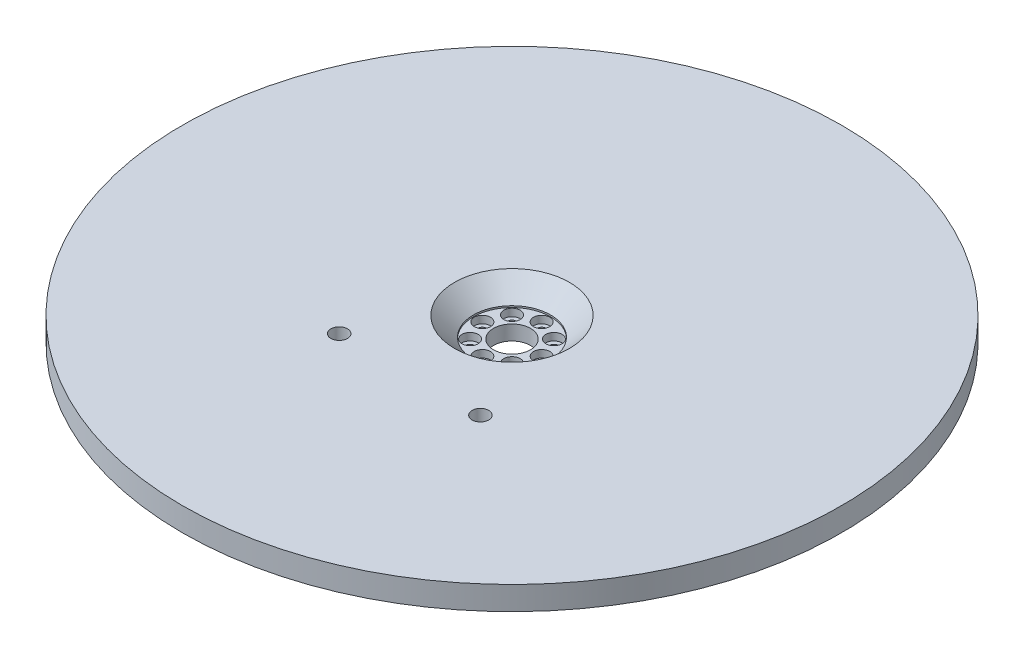
ISO-10303-21;
HEADER;
FILE_DESCRIPTION(('STEP AP214'),'2;1');
FILE_NAME('part.step','',(''),(''),'','','');
FILE_SCHEMA(('AUTOMOTIVE_DESIGN { 1 0 10303 214 1 1 1 1 }'));
ENDSEC;
DATA;
#1=APPLICATION_CONTEXT('core data for automotive mechanical design processes');
#2=APPLICATION_PROTOCOL_DEFINITION('international standard','automotive_design',2000,#1);
#3=PRODUCT_CONTEXT('',#1,'mechanical');
#4=PRODUCT('Part','Part','',(#3));
#5=PRODUCT_RELATED_PRODUCT_CATEGORY('part','',(#4));
#6=PRODUCT_DEFINITION_FORMATION('','',#4);
#7=PRODUCT_DEFINITION_CONTEXT('part definition',#1,'design');
#8=PRODUCT_DEFINITION('design','',#6,#7);
#9=PRODUCT_DEFINITION_SHAPE('','',#8);
#10=(LENGTH_UNIT() NAMED_UNIT(*) SI_UNIT(.MILLI.,.METRE.));
#11=(NAMED_UNIT(*) PLANE_ANGLE_UNIT() SI_UNIT($,.RADIAN.));
#12=(NAMED_UNIT(*) SI_UNIT($,.STERADIAN.) SOLID_ANGLE_UNIT());
#13=UNCERTAINTY_MEASURE_WITH_UNIT(LENGTH_MEASURE(1.E-05),#10,'distance_accuracy_value','');
#14=(GEOMETRIC_REPRESENTATION_CONTEXT(3) GLOBAL_UNCERTAINTY_ASSIGNED_CONTEXT((#13)) GLOBAL_UNIT_ASSIGNED_CONTEXT((#10,
#11,#12)) REPRESENTATION_CONTEXT('',''));
#15=CARTESIAN_POINT('',(0.,0.,0.));
#16=DIRECTION('',(0.,0.,1.));
#17=DIRECTION('',(1.,0.,0.));
#18=AXIS2_PLACEMENT_3D('',#15,#16,#17);
#19=CARTESIAN_POINT('',(0.,-2.35,0.));
#20=DIRECTION('',(0.,-1.,0.));
#21=DIRECTION('',(0.,0.,-1.));
#22=AXIS2_PLACEMENT_3D('',#19,#20,#21);
#23=PLANE('',#22);
#24=CARTESIAN_POINT('',(-5.6568542495,-2.35,-5.6568542495));
#25=DIRECTION('',(0.,1.,0.));
#26=DIRECTION('',(0.,0.,1.));
#27=AXIS2_PLACEMENT_3D('',#24,#25,#26);
#28=CIRCLE('',#27,2.19999999999999);
#29=CARTESIAN_POINT('',(-5.6568542495,-2.35,-3.45685424950001));
#30=VERTEX_POINT('',#29);
#31=EDGE_CURVE('E67',#30,#30,#28,.T.);
#32=ORIENTED_EDGE('',*,*,#31,.F.);
#33=EDGE_LOOP('',(#32));
#34=FACE_BOUND('',#33,.T.);
#35=CARTESIAN_POINT('',(0.,-2.35,-8.));
#36=DIRECTION('',(0.,1.,0.));
#37=DIRECTION('',(0.,0.,1.));
#38=AXIS2_PLACEMENT_3D('',#35,#36,#37);
#39=CIRCLE('',#38,2.19999999999999);
#40=CARTESIAN_POINT('',(0.,-2.35,-5.80000000000001));
#41=VERTEX_POINT('',#40);
#42=EDGE_CURVE('E71',#41,#41,#39,.T.);
#43=ORIENTED_EDGE('',*,*,#42,.F.);
#44=EDGE_LOOP('',(#43));
#45=FACE_BOUND('',#44,.T.);
#46=CARTESIAN_POINT('',(5.6568542495,-2.35,-5.6568542495));
#47=DIRECTION('',(0.,1.,0.));
#48=DIRECTION('',(0.,0.,1.));
#49=AXIS2_PLACEMENT_3D('',#46,#47,#48);
#50=CIRCLE('',#49,2.19999999999999);
#51=CARTESIAN_POINT('',(5.6568542495,-2.35,-3.45685424950001));
#52=VERTEX_POINT('',#51);
#53=EDGE_CURVE('E76',#52,#52,#50,.T.);
#54=ORIENTED_EDGE('',*,*,#53,.F.);
#55=EDGE_LOOP('',(#54));
#56=FACE_BOUND('',#55,.T.);
#57=CARTESIAN_POINT('',(8.,-2.35,0.));
#58=DIRECTION('',(0.,1.,0.));
#59=DIRECTION('',(0.,0.,1.));
#60=AXIS2_PLACEMENT_3D('',#57,#58,#59);
#61=CIRCLE('',#60,2.19999999999999);
#62=CARTESIAN_POINT('',(8.,-2.35,2.19999999999999));
#63=VERTEX_POINT('',#62);
#64=EDGE_CURVE('E81',#63,#63,#61,.T.);
#65=ORIENTED_EDGE('',*,*,#64,.F.);
#66=EDGE_LOOP('',(#65));
#67=FACE_BOUND('',#66,.T.);
#68=CARTESIAN_POINT('',(5.6568542495,-2.35,5.6568542495));
#69=DIRECTION('',(0.,1.,0.));
#70=DIRECTION('',(0.,0.,1.));
#71=AXIS2_PLACEMENT_3D('',#68,#69,#70);
#72=CIRCLE('',#71,2.19999999999999);
#73=CARTESIAN_POINT('',(5.6568542495,-2.35,7.85685424949999));
#74=VERTEX_POINT('',#73);
#75=EDGE_CURVE('E86',#74,#74,#72,.T.);
#76=ORIENTED_EDGE('',*,*,#75,.F.);
#77=EDGE_LOOP('',(#76));
#78=FACE_BOUND('',#77,.T.);
#79=CARTESIAN_POINT('',(-5.6568542495,-2.35,5.6568542495));
#80=DIRECTION('',(0.,1.,0.));
#81=DIRECTION('',(0.,0.,1.));
#82=AXIS2_PLACEMENT_3D('',#79,#80,#81);
#83=CIRCLE('',#82,2.19999999999999);
#84=CARTESIAN_POINT('',(-5.6568542495,-2.35,7.85685424949999));
#85=VERTEX_POINT('',#84);
#86=EDGE_CURVE('E96',#85,#85,#83,.T.);
#87=ORIENTED_EDGE('',*,*,#86,.F.);
#88=EDGE_LOOP('',(#87));
#89=FACE_BOUND('',#88,.T.);
#90=CARTESIAN_POINT('',(-8.,-2.35,0.));
#91=DIRECTION('',(0.,1.,0.));
#92=DIRECTION('',(0.,0.,1.));
#93=AXIS2_PLACEMENT_3D('',#90,#91,#92);
#94=CIRCLE('',#93,2.19999999999999);
#95=CARTESIAN_POINT('',(-8.,-2.35,2.19999999999999));
#96=VERTEX_POINT('',#95);
#97=EDGE_CURVE('E101',#96,#96,#94,.T.);
#98=ORIENTED_EDGE('',*,*,#97,.F.);
#99=EDGE_LOOP('',(#98));
#100=FACE_BOUND('',#99,.T.);
#101=CARTESIAN_POINT('',(0.,-2.35,0.));
#102=DIRECTION('',(0.,1.,0.));
#103=DIRECTION('',(0.,0.,1.));
#104=AXIS2_PLACEMENT_3D('',#101,#102,#103);
#105=CIRCLE('',#104,5.);
#106=CARTESIAN_POINT('',(0.,-2.35,5.));
#107=VERTEX_POINT('',#106);
#108=EDGE_CURVE('E119',#107,#107,#105,.T.);
#109=ORIENTED_EDGE('',*,*,#108,.F.);
#110=EDGE_LOOP('',(#109));
#111=FACE_BOUND('',#110,.T.);
#112=CARTESIAN_POINT('',(0.,-2.35,0.));
#113=DIRECTION('',(0.,-1.,0.));
#114=DIRECTION('',(0.,0.,-1.));
#115=AXIS2_PLACEMENT_3D('',#112,#113,#114);
#116=CIRCLE('',#115,10.4);
#117=CARTESIAN_POINT('',(0.,-2.35,-10.4));
#118=VERTEX_POINT('',#117);
#119=EDGE_CURVE('E116',#118,#118,#116,.F.);
#120=ORIENTED_EDGE('',*,*,#119,.T.);
#121=EDGE_LOOP('',(#120));
#122=FACE_BOUND('',#121,.T.);
#123=CARTESIAN_POINT('',(0.,-2.35,8.));
#124=DIRECTION('',(0.,1.,0.));
#125=DIRECTION('',(0.,0.,1.));
#126=AXIS2_PLACEMENT_3D('',#123,#124,#125);
#127=CIRCLE('',#126,2.19999999999999);
#128=CARTESIAN_POINT('',(0.,-2.35,10.2));
#129=VERTEX_POINT('',#128);
#130=EDGE_CURVE('E91',#129,#129,#127,.T.);
#131=ORIENTED_EDGE('',*,*,#130,.F.);
#132=EDGE_LOOP('',(#131));
#133=FACE_BOUND('',#132,.T.);
#134=ADVANCED_FACE('F40',(#34,#45,#56,#67,#78,#89,#100,#111,#122,#133),#23,.F.);
#135=CARTESIAN_POINT('',(0.,3.175,0.));
#136=DIRECTION('',(0.,-1.,0.));
#137=DIRECTION('',(0.,0.,-1.));
#138=AXIS2_PLACEMENT_3D('',#135,#136,#137);
#139=CYLINDRICAL_SURFACE('',#138,88.9);
#140=CARTESIAN_POINT('',(0.,3.175,0.));
#141=DIRECTION('',(0.,1.,0.));
#142=DIRECTION('',(0.,0.,1.));
#143=AXIS2_PLACEMENT_3D('',#140,#141,#142);
#144=CIRCLE('',#143,88.9);
#145=CARTESIAN_POINT('',(0.,3.175,88.9));
#146=VERTEX_POINT('',#145);
#147=EDGE_CURVE('E56',#146,#146,#144,.T.);
#148=ORIENTED_EDGE('',*,*,#147,.F.);
#149=EDGE_LOOP('',(#148));
#150=FACE_BOUND('',#149,.T.);
#151=CARTESIAN_POINT('',(0.,-3.175,0.));
#152=DIRECTION('',(0.,1.,0.));
#153=DIRECTION('',(0.,0.,1.));
#154=AXIS2_PLACEMENT_3D('',#151,#152,#153);
#155=CIRCLE('',#154,88.9);
#156=CARTESIAN_POINT('',(0.,-3.175,88.9));
#157=VERTEX_POINT('',#156);
#158=EDGE_CURVE('E108',#157,#157,#155,.T.);
#159=ORIENTED_EDGE('',*,*,#158,.T.);
#160=EDGE_LOOP('',(#159));
#161=FACE_BOUND('',#160,.T.);
#162=ADVANCED_FACE('F192',(#150,#161),#139,.T.);
#163=CARTESIAN_POINT('',(0.,3.175,0.));
#164=DIRECTION('',(0.,1.,0.));
#165=DIRECTION('',(0.,0.,1.));
#166=AXIS2_PLACEMENT_3D('',#163,#164,#165);
#167=PLANE('',#166);
#168=CARTESIAN_POINT('',(0.,3.175,0.));
#169=DIRECTION('',(0.,1.,0.));
#170=DIRECTION('',(0.,0.,1.));
#171=AXIS2_PLACEMENT_3D('',#168,#169,#170);
#172=CIRCLE('',#171,15.48);
#173=CARTESIAN_POINT('',(0.,3.175,15.48));
#174=VERTEX_POINT('',#173);
#175=EDGE_CURVE('E11',#174,#174,#172,.F.);
#176=ORIENTED_EDGE('',*,*,#175,.T.);
#177=EDGE_LOOP('',(#176));
#178=FACE_BOUND('',#177,.T.);
#179=CARTESIAN_POINT('',(19.0499999999564,3.175,27.5642423430902));
#180=DIRECTION('',(0.,1.,0.));
#181=DIRECTION('',(0.,0.,1.));
#182=AXIS2_PLACEMENT_3D('',#179,#180,#181);
#183=CIRCLE('',#182,2.24999999999999);
#184=CARTESIAN_POINT('',(19.0499999999564,3.175,29.8142423430901));
#185=VERTEX_POINT('',#184);
#186=EDGE_CURVE('E63',#185,#185,#183,.T.);
#187=ORIENTED_EDGE('',*,*,#186,.F.);
#188=EDGE_LOOP('',(#187));
#189=FACE_BOUND('',#188,.T.);
#190=CARTESIAN_POINT('',(-19.0500000000436,3.175,27.5642423430902));
#191=DIRECTION('',(0.,1.,0.));
#192=DIRECTION('',(0.,0.,1.));
#193=AXIS2_PLACEMENT_3D('',#190,#191,#192);
#194=CIRCLE('',#193,2.24999999999999);
#195=CARTESIAN_POINT('',(-19.0500000000436,3.175,29.8142423430901));
#196=VERTEX_POINT('',#195);
#197=EDGE_CURVE('E62',#196,#196,#194,.T.);
#198=ORIENTED_EDGE('',*,*,#197,.F.);
#199=EDGE_LOOP('',(#198));
#200=FACE_BOUND('',#199,.T.);
#201=ORIENTED_EDGE('',*,*,#147,.T.);
#202=EDGE_LOOP('',(#201));
#203=FACE_BOUND('',#202,.T.);
#204=ADVANCED_FACE('F188',(#178,#189,#200,#203),#167,.T.);
#205=CARTESIAN_POINT('',(0.,-3.175,0.));
#206=DIRECTION('',(0.,1.,0.));
#207=DIRECTION('',(0.,0.,1.));
#208=AXIS2_PLACEMENT_3D('',#205,#206,#207);
#209=PLANE('',#208);
#210=CARTESIAN_POINT('',(19.0499999999564,-3.175,27.5642423430902));
#211=DIRECTION('',(0.,1.,0.));
#212=DIRECTION('',(0.,0.,1.));
#213=AXIS2_PLACEMENT_3D('',#210,#211,#212);
#214=CIRCLE('',#213,2.24999999999999);
#215=CARTESIAN_POINT('',(19.0499999999564,-3.175,29.8142423430901));
#216=VERTEX_POINT('',#215);
#217=EDGE_CURVE('E59',#216,#216,#214,.T.);
#218=ORIENTED_EDGE('',*,*,#217,.T.);
#219=EDGE_LOOP('',(#218));
#220=FACE_BOUND('',#219,.T.);
#221=CARTESIAN_POINT('',(-19.0500000000436,-3.175,27.5642423430902));
#222=DIRECTION('',(0.,1.,0.));
#223=DIRECTION('',(0.,0.,1.));
#224=AXIS2_PLACEMENT_3D('',#221,#222,#223);
#225=CIRCLE('',#224,2.24999999999999);
#226=CARTESIAN_POINT('',(-19.0500000000436,-3.175,29.8142423430901));
#227=VERTEX_POINT('',#226);
#228=EDGE_CURVE('E64',#227,#227,#225,.T.);
#229=ORIENTED_EDGE('',*,*,#228,.T.);
#230=EDGE_LOOP('',(#229));
#231=FACE_BOUND('',#230,.T.);
#232=CARTESIAN_POINT('',(0.,-3.175,0.));
#233=DIRECTION('',(0.,1.,0.));
#234=DIRECTION('',(0.,0.,1.));
#235=AXIS2_PLACEMENT_3D('',#232,#233,#234);
#236=CIRCLE('',#235,12.065);
#237=CARTESIAN_POINT('',(0.,-3.175,12.065));
#238=VERTEX_POINT('',#237);
#239=EDGE_CURVE('E52',#238,#238,#236,.F.);
#240=ORIENTED_EDGE('',*,*,#239,.F.);
#241=EDGE_LOOP('',(#240));
#242=FACE_BOUND('',#241,.T.);
#243=ORIENTED_EDGE('',*,*,#158,.F.);
#244=EDGE_LOOP('',(#243));
#245=FACE_BOUND('',#244,.T.);
#246=ADVANCED_FACE('F191',(#220,#231,#242,#245),#209,.F.);
#247=CARTESIAN_POINT('',(0.,-6.35,0.));
#248=DIRECTION('',(0.,1.,0.));
#249=DIRECTION('',(0.,0.,1.));
#250=AXIS2_PLACEMENT_3D('',#247,#248,#249);
#251=CYLINDRICAL_SURFACE('',#250,12.065);
#252=CARTESIAN_POINT('',(0.,-6.35,0.));
#253=DIRECTION('',(0.,-1.,0.));
#254=DIRECTION('',(0.,0.,-1.));
#255=AXIS2_PLACEMENT_3D('',#252,#253,#254);
#256=CIRCLE('',#255,12.065);
#257=CARTESIAN_POINT('',(0.,-6.35,-12.065));
#258=VERTEX_POINT('',#257);
#259=EDGE_CURVE('E111',#258,#258,#256,.T.);
#260=ORIENTED_EDGE('',*,*,#259,.F.);
#261=EDGE_LOOP('',(#260));
#262=FACE_BOUND('',#261,.T.);
#263=ORIENTED_EDGE('',*,*,#239,.T.);
#264=EDGE_LOOP('',(#263));
#265=FACE_BOUND('',#264,.T.);
#266=ADVANCED_FACE('F203',(#262,#265),#251,.T.);
#267=CARTESIAN_POINT('',(0.,-6.35,0.));
#268=DIRECTION('',(0.,-1.,0.));
#269=DIRECTION('',(0.,0.,-1.));
#270=AXIS2_PLACEMENT_3D('',#267,#268,#269);
#271=PLANE('',#270);
#272=CARTESIAN_POINT('',(-5.6568542495,-6.35,-5.6568542495));
#273=DIRECTION('',(0.,-1.,0.));
#274=DIRECTION('',(0.,0.,-1.));
#275=AXIS2_PLACEMENT_3D('',#272,#273,#274);
#276=CIRCLE('',#275,1.1);
#277=CARTESIAN_POINT('',(-5.6568542495,-6.35,-6.7568542495));
#278=VERTEX_POINT('',#277);
#279=EDGE_CURVE('E68',#278,#278,#276,.T.);
#280=ORIENTED_EDGE('',*,*,#279,.F.);
#281=EDGE_LOOP('',(#280));
#282=FACE_BOUND('',#281,.T.);
#283=CARTESIAN_POINT('',(0.,-6.35,-8.));
#284=DIRECTION('',(0.,-1.,0.));
#285=DIRECTION('',(0.,0.,-1.));
#286=AXIS2_PLACEMENT_3D('',#283,#284,#285);
#287=CIRCLE('',#286,1.1);
#288=CARTESIAN_POINT('',(0.,-6.35,-9.1));
#289=VERTEX_POINT('',#288);
#290=EDGE_CURVE('E73',#289,#289,#287,.T.);
#291=ORIENTED_EDGE('',*,*,#290,.F.);
#292=EDGE_LOOP('',(#291));
#293=FACE_BOUND('',#292,.T.);
#294=CARTESIAN_POINT('',(5.6568542495,-6.35,-5.6568542495));
#295=DIRECTION('',(0.,-1.,0.));
#296=DIRECTION('',(0.,0.,-1.));
#297=AXIS2_PLACEMENT_3D('',#294,#295,#296);
#298=CIRCLE('',#297,1.1);
#299=CARTESIAN_POINT('',(5.6568542495,-6.35,-6.7568542495));
#300=VERTEX_POINT('',#299);
#301=EDGE_CURVE('E78',#300,#300,#298,.T.);
#302=ORIENTED_EDGE('',*,*,#301,.F.);
#303=EDGE_LOOP('',(#302));
#304=FACE_BOUND('',#303,.T.);
#305=CARTESIAN_POINT('',(8.,-6.35,0.));
#306=DIRECTION('',(0.,-1.,0.));
#307=DIRECTION('',(0.,0.,-1.));
#308=AXIS2_PLACEMENT_3D('',#305,#306,#307);
#309=CIRCLE('',#308,1.1);
#310=CARTESIAN_POINT('',(8.,-6.35,-1.1));
#311=VERTEX_POINT('',#310);
#312=EDGE_CURVE('E83',#311,#311,#309,.T.);
#313=ORIENTED_EDGE('',*,*,#312,.F.);
#314=EDGE_LOOP('',(#313));
#315=FACE_BOUND('',#314,.T.);
#316=CARTESIAN_POINT('',(5.6568542495,-6.35,5.6568542495));
#317=DIRECTION('',(0.,-1.,0.));
#318=DIRECTION('',(0.,0.,-1.));
#319=AXIS2_PLACEMENT_3D('',#316,#317,#318);
#320=CIRCLE('',#319,1.1);
#321=CARTESIAN_POINT('',(5.6568542495,-6.35,4.5568542495));
#322=VERTEX_POINT('',#321);
#323=EDGE_CURVE('E88',#322,#322,#320,.T.);
#324=ORIENTED_EDGE('',*,*,#323,.F.);
#325=EDGE_LOOP('',(#324));
#326=FACE_BOUND('',#325,.T.);
#327=CARTESIAN_POINT('',(0.,-6.35,8.));
#328=DIRECTION('',(0.,-1.,0.));
#329=DIRECTION('',(0.,0.,-1.));
#330=AXIS2_PLACEMENT_3D('',#327,#328,#329);
#331=CIRCLE('',#330,1.1);
#332=CARTESIAN_POINT('',(0.,-6.35,6.9));
#333=VERTEX_POINT('',#332);
#334=EDGE_CURVE('E93',#333,#333,#331,.T.);
#335=ORIENTED_EDGE('',*,*,#334,.F.);
#336=EDGE_LOOP('',(#335));
#337=FACE_BOUND('',#336,.T.);
#338=CARTESIAN_POINT('',(-5.6568542495,-6.35,5.6568542495));
#339=DIRECTION('',(0.,-1.,0.));
#340=DIRECTION('',(0.,0.,-1.));
#341=AXIS2_PLACEMENT_3D('',#338,#339,#340);
#342=CIRCLE('',#341,1.1);
#343=CARTESIAN_POINT('',(-5.6568542495,-6.35,4.5568542495));
#344=VERTEX_POINT('',#343);
#345=EDGE_CURVE('E98',#344,#344,#342,.T.);
#346=ORIENTED_EDGE('',*,*,#345,.F.);
#347=EDGE_LOOP('',(#346));
#348=FACE_BOUND('',#347,.T.);
#349=CARTESIAN_POINT('',(-8.,-6.35,0.));
#350=DIRECTION('',(0.,-1.,0.));
#351=DIRECTION('',(0.,0.,-1.));
#352=AXIS2_PLACEMENT_3D('',#349,#350,#351);
#353=CIRCLE('',#352,1.1);
#354=CARTESIAN_POINT('',(-8.,-6.35,-1.1));
#355=VERTEX_POINT('',#354);
#356=EDGE_CURVE('E103',#355,#355,#353,.T.);
#357=ORIENTED_EDGE('',*,*,#356,.F.);
#358=EDGE_LOOP('',(#357));
#359=FACE_BOUND('',#358,.T.);
#360=CARTESIAN_POINT('',(0.,-6.35,0.));
#361=DIRECTION('',(0.,-1.,0.));
#362=DIRECTION('',(0.,0.,-1.));
#363=AXIS2_PLACEMENT_3D('',#360,#361,#362);
#364=CIRCLE('',#363,5.);
#365=CARTESIAN_POINT('',(0.,-6.35,-5.));
#366=VERTEX_POINT('',#365);
#367=EDGE_CURVE('E105',#366,#366,#364,.F.);
#368=ORIENTED_EDGE('',*,*,#367,.T.);
#369=EDGE_LOOP('',(#368));
#370=FACE_BOUND('',#369,.T.);
#371=ORIENTED_EDGE('',*,*,#259,.T.);
#372=EDGE_LOOP('',(#371));
#373=FACE_BOUND('',#372,.T.);
#374=ADVANCED_FACE('F210',(#282,#293,#304,#315,#326,#337,#348,#359,#370,#373),#271,.T.);
#375=CARTESIAN_POINT('',(0.,-35.7656420973604,0.));
#376=DIRECTION('',(0.,1.,0.));
#377=DIRECTION('',(0.,0.,1.));
#378=AXIS2_PLACEMENT_3D('',#375,#376,#377);
#379=CYLINDRICAL_SURFACE('',#378,10.4);
#380=CARTESIAN_POINT('',(0.,-1.905,0.));
#381=DIRECTION('',(0.,1.,0.));
#382=DIRECTION('',(0.,0.,1.));
#383=AXIS2_PLACEMENT_3D('',#380,#381,#382);
#384=CIRCLE('',#383,10.4);
#385=CARTESIAN_POINT('',(0.,-1.905,10.4));
#386=VERTEX_POINT('',#385);
#387=EDGE_CURVE('E48',#386,#386,#384,.T.);
#388=ORIENTED_EDGE('',*,*,#387,.T.);
#389=EDGE_LOOP('',(#388));
#390=FACE_BOUND('',#389,.T.);
#391=ORIENTED_EDGE('',*,*,#119,.F.);
#392=EDGE_LOOP('',(#391));
#393=FACE_BOUND('',#392,.T.);
#394=ADVANCED_FACE('F223',(#390,#393),#379,.F.);
#395=CARTESIAN_POINT('',(0.,-6.351,0.));
#396=DIRECTION('',(0.,1.,0.));
#397=DIRECTION('',(0.,0.,1.));
#398=AXIS2_PLACEMENT_3D('',#395,#396,#397);
#399=CYLINDRICAL_SURFACE('',#398,5.);
#400=ORIENTED_EDGE('',*,*,#367,.F.);
#401=EDGE_LOOP('',(#400));
#402=FACE_BOUND('',#401,.T.);
#403=ORIENTED_EDGE('',*,*,#108,.T.);
#404=EDGE_LOOP('',(#403));
#405=FACE_BOUND('',#404,.T.);
#406=ADVANCED_FACE('F231',(#402,#405),#399,.F.);
#407=CARTESIAN_POINT('',(-8.,-2.35,0.));
#408=DIRECTION('',(0.,1.,0.));
#409=DIRECTION('',(0.,0.,1.));
#410=AXIS2_PLACEMENT_3D('',#407,#408,#409);
#411=CYLINDRICAL_SURFACE('',#410,1.1);
#412=ORIENTED_EDGE('',*,*,#356,.T.);
#413=EDGE_LOOP('',(#412));
#414=FACE_BOUND('',#413,.T.);
#415=CARTESIAN_POINT('',(-8.,-4.35,0.));
#416=DIRECTION('',(0.,1.,0.));
#417=DIRECTION('',(0.,0.,1.));
#418=AXIS2_PLACEMENT_3D('',#415,#416,#417);
#419=CIRCLE('',#418,1.1);
#420=CARTESIAN_POINT('',(-8.,-4.35,1.1));
#421=VERTEX_POINT('',#420);
#422=EDGE_CURVE('E106',#421,#421,#419,.T.);
#423=ORIENTED_EDGE('',*,*,#422,.T.);
#424=EDGE_LOOP('',(#423));
#425=FACE_BOUND('',#424,.T.);
#426=ADVANCED_FACE('F257',(#414,#425),#411,.F.);
#427=CARTESIAN_POINT('',(-6.9,-4.35,0.));
#428=DIRECTION('',(0.,-1.,0.));
#429=DIRECTION('',(0.,0.,-1.));
#430=AXIS2_PLACEMENT_3D('',#427,#428,#429);
#431=PLANE('',#430);
#432=ORIENTED_EDGE('',*,*,#422,.F.);
#433=EDGE_LOOP('',(#432));
#434=FACE_BOUND('',#433,.T.);
#435=CARTESIAN_POINT('',(-8.,-4.35,0.));
#436=DIRECTION('',(0.,1.,0.));
#437=DIRECTION('',(0.,0.,1.));
#438=AXIS2_PLACEMENT_3D('',#435,#436,#437);
#439=CIRCLE('',#438,2.2);
#440=CARTESIAN_POINT('',(-8.,-4.35,2.2));
#441=VERTEX_POINT('',#440);
#442=EDGE_CURVE('E126',#441,#441,#439,.T.);
#443=ORIENTED_EDGE('',*,*,#442,.T.);
#444=EDGE_LOOP('',(#443));
#445=FACE_BOUND('',#444,.T.);
#446=ADVANCED_FACE('F302',(#434,#445),#431,.F.);
#447=CARTESIAN_POINT('',(-8.,-2.35,0.));
#448=DIRECTION('',(0.,1.,0.));
#449=DIRECTION('',(0.,0.,1.));
#450=AXIS2_PLACEMENT_3D('',#447,#448,#449);
#451=CYLINDRICAL_SURFACE('',#450,2.19999999999999);
#452=ORIENTED_EDGE('',*,*,#442,.F.);
#453=EDGE_LOOP('',(#452));
#454=FACE_BOUND('',#453,.T.);
#455=ORIENTED_EDGE('',*,*,#97,.T.);
#456=EDGE_LOOP('',(#455));
#457=FACE_BOUND('',#456,.T.);
#458=ADVANCED_FACE('F298',(#454,#457),#451,.F.);
#459=CARTESIAN_POINT('',(-5.6568542495,-2.35,5.6568542495));
#460=DIRECTION('',(0.,1.,0.));
#461=DIRECTION('',(0.,0.,1.));
#462=AXIS2_PLACEMENT_3D('',#459,#460,#461);
#463=CYLINDRICAL_SURFACE('',#462,1.1);
#464=ORIENTED_EDGE('',*,*,#345,.T.);
#465=EDGE_LOOP('',(#464));
#466=FACE_BOUND('',#465,.T.);
#467=CARTESIAN_POINT('',(-5.6568542495,-4.35,5.6568542495));
#468=DIRECTION('',(0.,1.,0.));
#469=DIRECTION('',(0.,0.,1.));
#470=AXIS2_PLACEMENT_3D('',#467,#468,#469);
#471=CIRCLE('',#470,1.1);
#472=CARTESIAN_POINT('',(-5.6568542495,-4.35,6.7568542495));
#473=VERTEX_POINT('',#472);
#474=EDGE_CURVE('E102',#473,#473,#471,.T.);
#475=ORIENTED_EDGE('',*,*,#474,.T.);
#476=EDGE_LOOP('',(#475));
#477=FACE_BOUND('',#476,.T.);
#478=ADVANCED_FACE('F294',(#466,#477),#463,.F.);
#479=CARTESIAN_POINT('',(-4.5568542495,-4.35,5.6568542495));
#480=DIRECTION('',(0.,-1.,0.));
#481=DIRECTION('',(0.,0.,-1.));
#482=AXIS2_PLACEMENT_3D('',#479,#480,#481);
#483=PLANE('',#482);
#484=ORIENTED_EDGE('',*,*,#474,.F.);
#485=EDGE_LOOP('',(#484));
#486=FACE_BOUND('',#485,.T.);
#487=CARTESIAN_POINT('',(-5.6568542495,-4.35,5.6568542495));
#488=DIRECTION('',(0.,1.,0.));
#489=DIRECTION('',(0.,0.,1.));
#490=AXIS2_PLACEMENT_3D('',#487,#488,#489);
#491=CIRCLE('',#490,2.2);
#492=CARTESIAN_POINT('',(-5.6568542495,-4.35,7.8568542495));
#493=VERTEX_POINT('',#492);
#494=EDGE_CURVE('E133',#493,#493,#491,.T.);
#495=ORIENTED_EDGE('',*,*,#494,.T.);
#496=EDGE_LOOP('',(#495));
#497=FACE_BOUND('',#496,.T.);
#498=ADVANCED_FACE('F290',(#486,#497),#483,.F.);
#499=CARTESIAN_POINT('',(-5.6568542495,-2.35,5.6568542495));
#500=DIRECTION('',(0.,1.,0.));
#501=DIRECTION('',(0.,0.,1.));
#502=AXIS2_PLACEMENT_3D('',#499,#500,#501);
#503=CYLINDRICAL_SURFACE('',#502,2.19999999999999);
#504=ORIENTED_EDGE('',*,*,#494,.F.);
#505=EDGE_LOOP('',(#504));
#506=FACE_BOUND('',#505,.T.);
#507=ORIENTED_EDGE('',*,*,#86,.T.);
#508=EDGE_LOOP('',(#507));
#509=FACE_BOUND('',#508,.T.);
#510=ADVANCED_FACE('F286',(#506,#509),#503,.F.);
#511=CARTESIAN_POINT('',(0.,-2.35,8.));
#512=DIRECTION('',(0.,1.,0.));
#513=DIRECTION('',(0.,0.,1.));
#514=AXIS2_PLACEMENT_3D('',#511,#512,#513);
#515=CYLINDRICAL_SURFACE('',#514,1.1);
#516=ORIENTED_EDGE('',*,*,#334,.T.);
#517=EDGE_LOOP('',(#516));
#518=FACE_BOUND('',#517,.T.);
#519=CARTESIAN_POINT('',(0.,-4.35,8.));
#520=DIRECTION('',(0.,1.,0.));
#521=DIRECTION('',(0.,0.,1.));
#522=AXIS2_PLACEMENT_3D('',#519,#520,#521);
#523=CIRCLE('',#522,1.1);
#524=CARTESIAN_POINT('',(0.,-4.35,9.1));
#525=VERTEX_POINT('',#524);
#526=EDGE_CURVE('E97',#525,#525,#523,.T.);
#527=ORIENTED_EDGE('',*,*,#526,.T.);
#528=EDGE_LOOP('',(#527));
#529=FACE_BOUND('',#528,.T.);
#530=ADVANCED_FACE('F278',(#518,#529),#515,.F.);
#531=CARTESIAN_POINT('',(1.1,-4.35,8.));
#532=DIRECTION('',(0.,-1.,0.));
#533=DIRECTION('',(0.,0.,-1.));
#534=AXIS2_PLACEMENT_3D('',#531,#532,#533);
#535=PLANE('',#534);
#536=ORIENTED_EDGE('',*,*,#526,.F.);
#537=EDGE_LOOP('',(#536));
#538=FACE_BOUND('',#537,.T.);
#539=CARTESIAN_POINT('',(0.,-4.35,8.));
#540=DIRECTION('',(0.,1.,0.));
#541=DIRECTION('',(0.,0.,1.));
#542=AXIS2_PLACEMENT_3D('',#539,#540,#541);
#543=CIRCLE('',#542,2.2);
#544=CARTESIAN_POINT('',(0.,-4.35,10.2));
#545=VERTEX_POINT('',#544);
#546=EDGE_CURVE('E140',#545,#545,#543,.T.);
#547=ORIENTED_EDGE('',*,*,#546,.T.);
#548=EDGE_LOOP('',(#547));
#549=FACE_BOUND('',#548,.T.);
#550=ADVANCED_FACE('F268',(#538,#549),#535,.F.);
#551=CARTESIAN_POINT('',(0.,-2.35,8.));
#552=DIRECTION('',(0.,1.,0.));
#553=DIRECTION('',(0.,0.,1.));
#554=AXIS2_PLACEMENT_3D('',#551,#552,#553);
#555=CYLINDRICAL_SURFACE('',#554,2.19999999999999);
#556=ORIENTED_EDGE('',*,*,#546,.F.);
#557=EDGE_LOOP('',(#556));
#558=FACE_BOUND('',#557,.T.);
#559=ORIENTED_EDGE('',*,*,#130,.T.);
#560=EDGE_LOOP('',(#559));
#561=FACE_BOUND('',#560,.T.);
#562=ADVANCED_FACE('F265',(#558,#561),#555,.F.);
#563=CARTESIAN_POINT('',(5.6568542495,-2.35,5.6568542495));
#564=DIRECTION('',(0.,1.,0.));
#565=DIRECTION('',(0.,0.,1.));
#566=AXIS2_PLACEMENT_3D('',#563,#564,#565);
#567=CYLINDRICAL_SURFACE('',#566,1.1);
#568=ORIENTED_EDGE('',*,*,#323,.T.);
#569=EDGE_LOOP('',(#568));
#570=FACE_BOUND('',#569,.T.);
#571=CARTESIAN_POINT('',(5.6568542495,-4.35,5.6568542495));
#572=DIRECTION('',(0.,1.,0.));
#573=DIRECTION('',(0.,0.,1.));
#574=AXIS2_PLACEMENT_3D('',#571,#572,#573);
#575=CIRCLE('',#574,1.1);
#576=CARTESIAN_POINT('',(5.6568542495,-4.35,6.7568542495));
#577=VERTEX_POINT('',#576);
#578=EDGE_CURVE('E92',#577,#577,#575,.T.);
#579=ORIENTED_EDGE('',*,*,#578,.T.);
#580=EDGE_LOOP('',(#579));
#581=FACE_BOUND('',#580,.T.);
#582=ADVANCED_FACE('F267',(#570,#581),#567,.F.);
#583=CARTESIAN_POINT('',(6.7568542495,-4.35,5.6568542495));
#584=DIRECTION('',(0.,-1.,0.));
#585=DIRECTION('',(0.,0.,-1.));
#586=AXIS2_PLACEMENT_3D('',#583,#584,#585);
#587=PLANE('',#586);
#588=ORIENTED_EDGE('',*,*,#578,.F.);
#589=EDGE_LOOP('',(#588));
#590=FACE_BOUND('',#589,.T.);
#591=CARTESIAN_POINT('',(5.6568542495,-4.35,5.6568542495));
#592=DIRECTION('',(0.,1.,0.));
#593=DIRECTION('',(0.,0.,1.));
#594=AXIS2_PLACEMENT_3D('',#591,#592,#593);
#595=CIRCLE('',#594,2.2);
#596=CARTESIAN_POINT('',(5.6568542495,-4.35,7.8568542495));
#597=VERTEX_POINT('',#596);
#598=EDGE_CURVE('E147',#597,#597,#595,.T.);
#599=ORIENTED_EDGE('',*,*,#598,.T.);
#600=EDGE_LOOP('',(#599));
#601=FACE_BOUND('',#600,.T.);
#602=ADVANCED_FACE('F275',(#590,#601),#587,.F.);
#603=CARTESIAN_POINT('',(5.6568542495,-2.35,5.6568542495));
#604=DIRECTION('',(0.,1.,0.));
#605=DIRECTION('',(0.,0.,1.));
#606=AXIS2_PLACEMENT_3D('',#603,#604,#605);
#607=CYLINDRICAL_SURFACE('',#606,2.19999999999999);
#608=ORIENTED_EDGE('',*,*,#598,.F.);
#609=EDGE_LOOP('',(#608));
#610=FACE_BOUND('',#609,.T.);
#611=ORIENTED_EDGE('',*,*,#75,.T.);
#612=EDGE_LOOP('',(#611));
#613=FACE_BOUND('',#612,.T.);
#614=ADVANCED_FACE('F370',(#610,#613),#607,.F.);
#615=CARTESIAN_POINT('',(8.,-2.35,0.));
#616=DIRECTION('',(0.,1.,0.));
#617=DIRECTION('',(0.,0.,1.));
#618=AXIS2_PLACEMENT_3D('',#615,#616,#617);
#619=CYLINDRICAL_SURFACE('',#618,1.1);
#620=ORIENTED_EDGE('',*,*,#312,.T.);
#621=EDGE_LOOP('',(#620));
#622=FACE_BOUND('',#621,.T.);
#623=CARTESIAN_POINT('',(8.,-4.35,0.));
#624=DIRECTION('',(0.,1.,0.));
#625=DIRECTION('',(0.,0.,1.));
#626=AXIS2_PLACEMENT_3D('',#623,#624,#625);
#627=CIRCLE('',#626,1.1);
#628=CARTESIAN_POINT('',(8.,-4.35,1.1));
#629=VERTEX_POINT('',#628);
#630=EDGE_CURVE('E87',#629,#629,#627,.T.);
#631=ORIENTED_EDGE('',*,*,#630,.T.);
#632=EDGE_LOOP('',(#631));
#633=FACE_BOUND('',#632,.T.);
#634=ADVANCED_FACE('F380',(#622,#633),#619,.F.);
#635=CARTESIAN_POINT('',(9.1,-4.35,0.));
#636=DIRECTION('',(0.,-1.,0.));
#637=DIRECTION('',(0.,0.,-1.));
#638=AXIS2_PLACEMENT_3D('',#635,#636,#637);
#639=PLANE('',#638);
#640=ORIENTED_EDGE('',*,*,#630,.F.);
#641=EDGE_LOOP('',(#640));
#642=FACE_BOUND('',#641,.T.);
#643=CARTESIAN_POINT('',(8.,-4.35,0.));
#644=DIRECTION('',(0.,1.,0.));
#645=DIRECTION('',(0.,0.,1.));
#646=AXIS2_PLACEMENT_3D('',#643,#644,#645);
#647=CIRCLE('',#646,2.2);
#648=CARTESIAN_POINT('',(8.,-4.35,2.2));
#649=VERTEX_POINT('',#648);
#650=EDGE_CURVE('E154',#649,#649,#647,.T.);
#651=ORIENTED_EDGE('',*,*,#650,.T.);
#652=EDGE_LOOP('',(#651));
#653=FACE_BOUND('',#652,.T.);
#654=ADVANCED_FACE('F391',(#642,#653),#639,.F.);
#655=CARTESIAN_POINT('',(8.,-2.35,0.));
#656=DIRECTION('',(0.,1.,0.));
#657=DIRECTION('',(0.,0.,1.));
#658=AXIS2_PLACEMENT_3D('',#655,#656,#657);
#659=CYLINDRICAL_SURFACE('',#658,2.2);
#660=ORIENTED_EDGE('',*,*,#650,.F.);
#661=EDGE_LOOP('',(#660));
#662=FACE_BOUND('',#661,.T.);
#663=ORIENTED_EDGE('',*,*,#64,.T.);
#664=EDGE_LOOP('',(#663));
#665=FACE_BOUND('',#664,.T.);
#666=ADVANCED_FACE('F402',(#662,#665),#659,.F.);
#667=CARTESIAN_POINT('',(5.6568542495,-2.35,-5.6568542495));
#668=DIRECTION('',(0.,1.,0.));
#669=DIRECTION('',(0.,0.,1.));
#670=AXIS2_PLACEMENT_3D('',#667,#668,#669);
#671=CYLINDRICAL_SURFACE('',#670,1.1);
#672=ORIENTED_EDGE('',*,*,#301,.T.);
#673=EDGE_LOOP('',(#672));
#674=FACE_BOUND('',#673,.T.);
#675=CARTESIAN_POINT('',(5.6568542495,-4.35,-5.6568542495));
#676=DIRECTION('',(0.,1.,0.));
#677=DIRECTION('',(0.,0.,1.));
#678=AXIS2_PLACEMENT_3D('',#675,#676,#677);
#679=CIRCLE('',#678,1.1);
#680=CARTESIAN_POINT('',(5.6568542495,-4.35,-4.5568542495));
#681=VERTEX_POINT('',#680);
#682=EDGE_CURVE('E82',#681,#681,#679,.T.);
#683=ORIENTED_EDGE('',*,*,#682,.T.);
#684=EDGE_LOOP('',(#683));
#685=FACE_BOUND('',#684,.T.);
#686=ADVANCED_FACE('F413',(#674,#685),#671,.F.);
#687=CARTESIAN_POINT('',(6.7568542495,-4.35,-5.6568542495));
#688=DIRECTION('',(0.,-1.,0.));
#689=DIRECTION('',(0.,0.,-1.));
#690=AXIS2_PLACEMENT_3D('',#687,#688,#689);
#691=PLANE('',#690);
#692=ORIENTED_EDGE('',*,*,#682,.F.);
#693=EDGE_LOOP('',(#692));
#694=FACE_BOUND('',#693,.T.);
#695=CARTESIAN_POINT('',(5.6568542495,-4.35,-5.6568542495));
#696=DIRECTION('',(0.,1.,0.));
#697=DIRECTION('',(0.,0.,1.));
#698=AXIS2_PLACEMENT_3D('',#695,#696,#697);
#699=CIRCLE('',#698,2.2);
#700=CARTESIAN_POINT('',(5.6568542495,-4.35,-3.4568542495));
#701=VERTEX_POINT('',#700);
#702=EDGE_CURVE('E161',#701,#701,#699,.T.);
#703=ORIENTED_EDGE('',*,*,#702,.T.);
#704=EDGE_LOOP('',(#703));
#705=FACE_BOUND('',#704,.T.);
#706=ADVANCED_FACE('F424',(#694,#705),#691,.F.);
#707=CARTESIAN_POINT('',(5.6568542495,-2.35,-5.6568542495));
#708=DIRECTION('',(0.,1.,0.));
#709=DIRECTION('',(0.,0.,1.));
#710=AXIS2_PLACEMENT_3D('',#707,#708,#709);
#711=CYLINDRICAL_SURFACE('',#710,2.19999999999999);
#712=ORIENTED_EDGE('',*,*,#702,.F.);
#713=EDGE_LOOP('',(#712));
#714=FACE_BOUND('',#713,.T.);
#715=ORIENTED_EDGE('',*,*,#53,.T.);
#716=EDGE_LOOP('',(#715));
#717=FACE_BOUND('',#716,.T.);
#718=ADVANCED_FACE('F435',(#714,#717),#711,.F.);
#719=CARTESIAN_POINT('',(0.,-2.35,-8.));
#720=DIRECTION('',(0.,1.,0.));
#721=DIRECTION('',(0.,0.,1.));
#722=AXIS2_PLACEMENT_3D('',#719,#720,#721);
#723=CYLINDRICAL_SURFACE('',#722,1.1);
#724=ORIENTED_EDGE('',*,*,#290,.T.);
#725=EDGE_LOOP('',(#724));
#726=FACE_BOUND('',#725,.T.);
#727=CARTESIAN_POINT('',(0.,-4.35,-8.));
#728=DIRECTION('',(0.,1.,0.));
#729=DIRECTION('',(0.,0.,1.));
#730=AXIS2_PLACEMENT_3D('',#727,#728,#729);
#731=CIRCLE('',#730,1.1);
#732=CARTESIAN_POINT('',(0.,-4.35,-6.9));
#733=VERTEX_POINT('',#732);
#734=EDGE_CURVE('E77',#733,#733,#731,.T.);
#735=ORIENTED_EDGE('',*,*,#734,.T.);
#736=EDGE_LOOP('',(#735));
#737=FACE_BOUND('',#736,.T.);
#738=ADVANCED_FACE('F446',(#726,#737),#723,.F.);
#739=CARTESIAN_POINT('',(1.1,-4.35,-8.));
#740=DIRECTION('',(0.,-1.,0.));
#741=DIRECTION('',(0.,0.,-1.));
#742=AXIS2_PLACEMENT_3D('',#739,#740,#741);
#743=PLANE('',#742);
#744=ORIENTED_EDGE('',*,*,#734,.F.);
#745=EDGE_LOOP('',(#744));
#746=FACE_BOUND('',#745,.T.);
#747=CARTESIAN_POINT('',(0.,-4.35,-8.));
#748=DIRECTION('',(0.,1.,0.));
#749=DIRECTION('',(0.,0.,1.));
#750=AXIS2_PLACEMENT_3D('',#747,#748,#749);
#751=CIRCLE('',#750,2.2);
#752=CARTESIAN_POINT('',(0.,-4.35,-5.8));
#753=VERTEX_POINT('',#752);
#754=EDGE_CURVE('E168',#753,#753,#751,.T.);
#755=ORIENTED_EDGE('',*,*,#754,.T.);
#756=EDGE_LOOP('',(#755));
#757=FACE_BOUND('',#756,.T.);
#758=ADVANCED_FACE('F457',(#746,#757),#743,.F.);
#759=CARTESIAN_POINT('',(0.,-2.35,-8.));
#760=DIRECTION('',(0.,1.,0.));
#761=DIRECTION('',(0.,0.,1.));
#762=AXIS2_PLACEMENT_3D('',#759,#760,#761);
#763=CYLINDRICAL_SURFACE('',#762,2.19999999999999);
#764=ORIENTED_EDGE('',*,*,#754,.F.);
#765=EDGE_LOOP('',(#764));
#766=FACE_BOUND('',#765,.T.);
#767=ORIENTED_EDGE('',*,*,#42,.T.);
#768=EDGE_LOOP('',(#767));
#769=FACE_BOUND('',#768,.T.);
#770=ADVANCED_FACE('F468',(#766,#769),#763,.F.);
#771=CARTESIAN_POINT('',(-5.6568542495,-2.35,-5.6568542495));
#772=DIRECTION('',(0.,1.,0.));
#773=DIRECTION('',(0.,0.,1.));
#774=AXIS2_PLACEMENT_3D('',#771,#772,#773);
#775=CYLINDRICAL_SURFACE('',#774,1.1);
#776=ORIENTED_EDGE('',*,*,#279,.T.);
#777=EDGE_LOOP('',(#776));
#778=FACE_BOUND('',#777,.T.);
#779=CARTESIAN_POINT('',(-5.6568542495,-4.35,-5.6568542495));
#780=DIRECTION('',(0.,1.,0.));
#781=DIRECTION('',(0.,0.,1.));
#782=AXIS2_PLACEMENT_3D('',#779,#780,#781);
#783=CIRCLE('',#782,1.1);
#784=CARTESIAN_POINT('',(-5.6568542495,-4.35,-4.5568542495));
#785=VERTEX_POINT('',#784);
#786=EDGE_CURVE('E72',#785,#785,#783,.T.);
#787=ORIENTED_EDGE('',*,*,#786,.T.);
#788=EDGE_LOOP('',(#787));
#789=FACE_BOUND('',#788,.T.);
#790=ADVANCED_FACE('F479',(#778,#789),#775,.F.);
#791=CARTESIAN_POINT('',(-4.5568542495,-4.35,-5.6568542495));
#792=DIRECTION('',(0.,-1.,0.));
#793=DIRECTION('',(0.,0.,-1.));
#794=AXIS2_PLACEMENT_3D('',#791,#792,#793);
#795=PLANE('',#794);
#796=ORIENTED_EDGE('',*,*,#786,.F.);
#797=EDGE_LOOP('',(#796));
#798=FACE_BOUND('',#797,.T.);
#799=CARTESIAN_POINT('',(-5.6568542495,-4.35,-5.6568542495));
#800=DIRECTION('',(0.,1.,0.));
#801=DIRECTION('',(0.,0.,1.));
#802=AXIS2_PLACEMENT_3D('',#799,#800,#801);
#803=CIRCLE('',#802,2.2);
#804=CARTESIAN_POINT('',(-5.6568542495,-4.35,-3.4568542495));
#805=VERTEX_POINT('',#804);
#806=EDGE_CURVE('E175',#805,#805,#803,.T.);
#807=ORIENTED_EDGE('',*,*,#806,.T.);
#808=EDGE_LOOP('',(#807));
#809=FACE_BOUND('',#808,.T.);
#810=ADVANCED_FACE('F490',(#798,#809),#795,.F.);
#811=CARTESIAN_POINT('',(-5.6568542495,-2.35,-5.6568542495));
#812=DIRECTION('',(0.,1.,0.));
#813=DIRECTION('',(0.,0.,1.));
#814=AXIS2_PLACEMENT_3D('',#811,#812,#813);
#815=CYLINDRICAL_SURFACE('',#814,2.19999999999999);
#816=ORIENTED_EDGE('',*,*,#806,.F.);
#817=EDGE_LOOP('',(#816));
#818=FACE_BOUND('',#817,.T.);
#819=ORIENTED_EDGE('',*,*,#31,.T.);
#820=EDGE_LOOP('',(#819));
#821=FACE_BOUND('',#820,.T.);
#822=ADVANCED_FACE('F501',(#818,#821),#815,.F.);
#823=CARTESIAN_POINT('',(-19.0500000000436,3.175,27.5642423430902));
#824=DIRECTION('',(0.,1.,0.));
#825=DIRECTION('',(0.,0.,1.));
#826=AXIS2_PLACEMENT_3D('',#823,#824,#825);
#827=CYLINDRICAL_SURFACE('',#826,2.24999999999999);
#828=ORIENTED_EDGE('',*,*,#197,.T.);
#829=EDGE_LOOP('',(#828));
#830=FACE_BOUND('',#829,.T.);
#831=ORIENTED_EDGE('',*,*,#228,.F.);
#832=EDGE_LOOP('',(#831));
#833=FACE_BOUND('',#832,.T.);
#834=ADVANCED_FACE('F511',(#830,#833),#827,.F.);
#835=CARTESIAN_POINT('',(19.0499999999564,3.175,27.5642423430902));
#836=DIRECTION('',(0.,1.,0.));
#837=DIRECTION('',(0.,0.,1.));
#838=AXIS2_PLACEMENT_3D('',#835,#836,#837);
#839=CYLINDRICAL_SURFACE('',#838,2.24999999999999);
#840=ORIENTED_EDGE('',*,*,#186,.T.);
#841=EDGE_LOOP('',(#840));
#842=FACE_BOUND('',#841,.T.);
#843=ORIENTED_EDGE('',*,*,#217,.F.);
#844=EDGE_LOOP('',(#843));
#845=FACE_BOUND('',#844,.T.);
#846=ADVANCED_FACE('F185',(#842,#845),#839,.F.);
#847=CARTESIAN_POINT('',(0.,-1.905,0.));
#848=DIRECTION('',(0.,1.,0.));
#849=DIRECTION('',(0.,0.,1.));
#850=AXIS2_PLACEMENT_3D('',#847,#848,#849);
#851=CONICAL_SURFACE('',#850,10.4,0.78539816339745);
#852=ORIENTED_EDGE('',*,*,#175,.F.);
#853=EDGE_LOOP('',(#852));
#854=FACE_BOUND('',#853,.T.);
#855=ORIENTED_EDGE('',*,*,#387,.F.);
#856=EDGE_LOOP('',(#855));
#857=FACE_BOUND('',#856,.T.);
#858=ADVANCED_FACE('F43',(#854,#857),#851,.F.);
#859=CLOSED_SHELL('',(#134,#162,#204,#246,#266,#374,#394,#406,#426,#446,#458,#478,#498,#510,
#530,#550,#562,#582,#602,#614,#634,#654,#666,#686,#706,#718,#738,#758,#770,#790,#810,#822,#834,
#846,#858));
#860=MANIFOLD_SOLID_BREP('B2',#859);
#861=ADVANCED_BREP_SHAPE_REPRESENTATION('',(#18,#860),#14);
#862=SHAPE_DEFINITION_REPRESENTATION(#9,#861);
ENDSEC;
END-ISO-10303-21;
